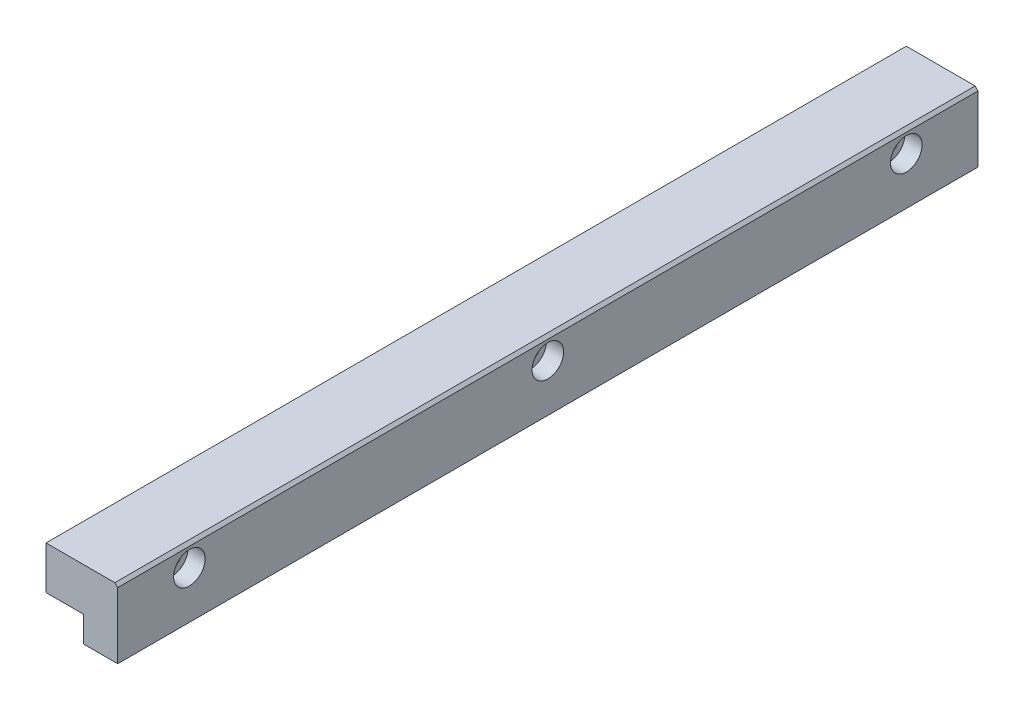
ISO-10303-21;
HEADER;
FILE_DESCRIPTION(('STEP AP214'),'2;1');
FILE_NAME('part.step','',(''),(''),'','','');
FILE_SCHEMA(('AUTOMOTIVE_DESIGN { 1 0 10303 214 1 1 1 1 }'));
ENDSEC;
DATA;
#1=APPLICATION_CONTEXT('core data for automotive mechanical design processes');
#2=APPLICATION_PROTOCOL_DEFINITION('international standard','automotive_design',2000,#1);
#3=PRODUCT_CONTEXT('',#1,'mechanical');
#4=PRODUCT('Part','Part','',(#3));
#5=PRODUCT_RELATED_PRODUCT_CATEGORY('part','',(#4));
#6=PRODUCT_DEFINITION_FORMATION('','',#4);
#7=PRODUCT_DEFINITION_CONTEXT('part definition',#1,'design');
#8=PRODUCT_DEFINITION('design','',#6,#7);
#9=PRODUCT_DEFINITION_SHAPE('','',#8);
#10=(LENGTH_UNIT() NAMED_UNIT(*) SI_UNIT(.MILLI.,.METRE.));
#11=(NAMED_UNIT(*) PLANE_ANGLE_UNIT() SI_UNIT($,.RADIAN.));
#12=(NAMED_UNIT(*) SI_UNIT($,.STERADIAN.) SOLID_ANGLE_UNIT());
#13=UNCERTAINTY_MEASURE_WITH_UNIT(LENGTH_MEASURE(1.E-05),#10,'distance_accuracy_value','');
#14=(GEOMETRIC_REPRESENTATION_CONTEXT(3) GLOBAL_UNCERTAINTY_ASSIGNED_CONTEXT((#13)) GLOBAL_UNIT_ASSIGNED_CONTEXT((#10,
#11,#12)) REPRESENTATION_CONTEXT('',''));
#15=CARTESIAN_POINT('',(0.,0.,0.));
#16=DIRECTION('',(0.,0.,1.));
#17=DIRECTION('',(1.,0.,0.));
#18=AXIS2_PLACEMENT_3D('',#15,#16,#17);
#19=CARTESIAN_POINT('',(25.,440.,-300.));
#20=DIRECTION('',(1.,0.,0.));
#21=DIRECTION('',(0.,1.,0.));
#22=AXIS2_PLACEMENT_3D('',#19,#20,#21);
#23=PLANE('',#22);
#24=CARTESIAN_POINT('',(24.9999999999999,457.5,-25.));
#25=DIRECTION('',(1.,0.,0.));
#26=DIRECTION('',(0.,0.,-1.));
#27=AXIS2_PLACEMENT_3D('',#24,#25,#26);
#28=CIRCLE('',#27,5.50000000000001);
#29=CARTESIAN_POINT('',(24.9999999999999,457.5,-30.5));
#30=VERTEX_POINT('',#29);
#31=EDGE_CURVE('E175',#30,#30,#28,.T.);
#32=ORIENTED_EDGE('',*,*,#31,.F.);
#33=EDGE_LOOP('',(#32));
#34=FACE_BOUND('',#33,.T.);
#35=CARTESIAN_POINT('',(24.9999999999999,457.5,-275.));
#36=DIRECTION('',(1.,0.,0.));
#37=DIRECTION('',(0.,0.,-1.));
#38=AXIS2_PLACEMENT_3D('',#35,#36,#37);
#39=CIRCLE('',#38,5.50000000000001);
#40=CARTESIAN_POINT('',(24.9999999999999,457.5,-280.5));
#41=VERTEX_POINT('',#40);
#42=EDGE_CURVE('E219',#41,#41,#39,.T.);
#43=ORIENTED_EDGE('',*,*,#42,.F.);
#44=EDGE_LOOP('',(#43));
#45=FACE_BOUND('',#44,.T.);
#46=CARTESIAN_POINT('',(24.9999999999999,457.5,-150.));
#47=DIRECTION('',(1.,0.,0.));
#48=DIRECTION('',(0.,0.,-1.));
#49=AXIS2_PLACEMENT_3D('',#46,#47,#48);
#50=CIRCLE('',#49,5.50000000000001);
#51=CARTESIAN_POINT('',(24.9999999999999,457.5,-155.5));
#52=VERTEX_POINT('',#51);
#53=EDGE_CURVE('E207',#52,#52,#50,.T.);
#54=ORIENTED_EDGE('',*,*,#53,.F.);
#55=EDGE_LOOP('',(#54));
#56=FACE_BOUND('',#55,.T.);
#57=DIRECTION('',(0.,1.,0.));
#58=VECTOR('',#57,1.);
#59=CARTESIAN_POINT('',(25.,440.,-300.));
#60=LINE('',#59,#58);
#61=CARTESIAN_POINT('',(25.,441.,-300.));
#62=VERTEX_POINT('',#61);
#63=CARTESIAN_POINT('',(25.,464.,-300.));
#64=VERTEX_POINT('',#63);
#65=EDGE_CURVE('E110',#62,#64,#60,.T.);
#66=ORIENTED_EDGE('',*,*,#65,.T.);
#67=DIRECTION('',(0.,0.,1.));
#68=VECTOR('',#67,1.);
#69=CARTESIAN_POINT('',(25.,464.,-300.));
#70=LINE('',#69,#68);
#71=CARTESIAN_POINT('',(25.,464.,0.));
#72=VERTEX_POINT('',#71);
#73=EDGE_CURVE('E164',#64,#72,#70,.T.);
#74=ORIENTED_EDGE('',*,*,#73,.T.);
#75=DIRECTION('',(0.,1.,0.));
#76=VECTOR('',#75,1.);
#77=CARTESIAN_POINT('',(25.,440.,0.));
#78=LINE('',#77,#76);
#79=CARTESIAN_POINT('',(25.,441.,0.));
#80=VERTEX_POINT('',#79);
#81=EDGE_CURVE('E131',#80,#72,#78,.T.);
#82=ORIENTED_EDGE('',*,*,#81,.F.);
#83=DIRECTION('',(0.,0.,-1.));
#84=VECTOR('',#83,1.);
#85=CARTESIAN_POINT('',(25.,441.,-300.));
#86=LINE('',#85,#84);
#87=EDGE_CURVE('E155',#80,#62,#86,.T.);
#88=ORIENTED_EDGE('',*,*,#87,.T.);
#89=EDGE_LOOP('',(#66,#74,#82,#88));
#90=FACE_BOUND('',#89,.T.);
#91=ADVANCED_FACE('F34',(#34,#45,#56,#90),#23,.T.);
#92=CARTESIAN_POINT('',(25.,440.,-300.));
#93=DIRECTION('',(0.,-1.,0.));
#94=DIRECTION('',(0.,0.,-1.));
#95=AXIS2_PLACEMENT_3D('',#92,#93,#94);
#96=PLANE('',#95);
#97=DIRECTION('',(1.,0.,0.));
#98=VECTOR('',#97,1.);
#99=CARTESIAN_POINT('',(25.,440.,-299.));
#100=LINE('',#99,#98);
#101=CARTESIAN_POINT('',(14.,440.,-299.));
#102=VERTEX_POINT('',#101);
#103=CARTESIAN_POINT('',(24.,440.,-299.));
#104=VERTEX_POINT('',#103);
#105=EDGE_CURVE('E150',#102,#104,#100,.T.);
#106=ORIENTED_EDGE('',*,*,#105,.T.);
#107=DIRECTION('',(0.,0.,1.));
#108=VECTOR('',#107,1.);
#109=CARTESIAN_POINT('',(24.,440.,-300.));
#110=LINE('',#109,#108);
#111=CARTESIAN_POINT('',(24.,440.,-0.999999999999945));
#112=VERTEX_POINT('',#111);
#113=EDGE_CURVE('E152',#104,#112,#110,.T.);
#114=ORIENTED_EDGE('',*,*,#113,.T.);
#115=DIRECTION('',(-1.,0.,0.));
#116=VECTOR('',#115,1.);
#117=CARTESIAN_POINT('',(25.,440.,-0.999999999999945));
#118=LINE('',#117,#116);
#119=CARTESIAN_POINT('',(14.,440.,-0.999999999999945));
#120=VERTEX_POINT('',#119);
#121=EDGE_CURVE('E145',#112,#120,#118,.T.);
#122=ORIENTED_EDGE('',*,*,#121,.T.);
#123=DIRECTION('',(0.,0.,-1.));
#124=VECTOR('',#123,1.);
#125=CARTESIAN_POINT('',(14.,440.,-300.));
#126=LINE('',#125,#124);
#127=EDGE_CURVE('E148',#120,#102,#126,.T.);
#128=ORIENTED_EDGE('',*,*,#127,.T.);
#129=EDGE_LOOP('',(#106,#114,#122,#128));
#130=FACE_BOUND('',#129,.T.);
#131=ADVANCED_FACE('F238',(#130),#96,.T.);
#132=CARTESIAN_POINT('',(13.,440.,-300.));
#133=DIRECTION('',(-1.,0.,0.));
#134=DIRECTION('',(0.,0.,1.));
#135=AXIS2_PLACEMENT_3D('',#132,#133,#134);
#136=PLANE('',#135);
#137=DIRECTION('',(0.,-1.,0.));
#138=VECTOR('',#137,1.);
#139=CARTESIAN_POINT('',(13.,440.,-300.));
#140=LINE('',#139,#138);
#141=CARTESIAN_POINT('',(13.,450.,-300.));
#142=VERTEX_POINT('',#141);
#143=CARTESIAN_POINT('',(13.,441.,-300.));
#144=VERTEX_POINT('',#143);
#145=EDGE_CURVE('E118',#142,#144,#140,.T.);
#146=ORIENTED_EDGE('',*,*,#145,.T.);
#147=DIRECTION('',(0.,0.,1.));
#148=VECTOR('',#147,1.);
#149=CARTESIAN_POINT('',(13.,441.,-300.));
#150=LINE('',#149,#148);
#151=CARTESIAN_POINT('',(13.,441.,0.));
#152=VERTEX_POINT('',#151);
#153=EDGE_CURVE('E160',#144,#152,#150,.T.);
#154=ORIENTED_EDGE('',*,*,#153,.T.);
#155=DIRECTION('',(0.,-1.,0.));
#156=VECTOR('',#155,1.);
#157=CARTESIAN_POINT('',(13.,440.,0.));
#158=LINE('',#157,#156);
#159=CARTESIAN_POINT('',(13.,450.,0.));
#160=VERTEX_POINT('',#159);
#161=EDGE_CURVE('E140',#160,#152,#158,.T.);
#162=ORIENTED_EDGE('',*,*,#161,.F.);
#163=DIRECTION('',(0.,0.,1.));
#164=VECTOR('',#163,1.);
#165=CARTESIAN_POINT('',(13.,450.,-300.));
#166=LINE('',#165,#164);
#167=EDGE_CURVE('E143',#142,#160,#166,.T.);
#168=ORIENTED_EDGE('',*,*,#167,.F.);
#169=EDGE_LOOP('',(#146,#154,#162,#168));
#170=FACE_BOUND('',#169,.T.);
#171=ADVANCED_FACE('F272',(#170),#136,.T.);
#172=CARTESIAN_POINT('',(0.,450.,-300.));
#173=DIRECTION('',(0.,-1.,0.));
#174=DIRECTION('',(0.,0.,-1.));
#175=AXIS2_PLACEMENT_3D('',#172,#173,#174);
#176=PLANE('',#175);
#177=DIRECTION('',(1.,0.,0.));
#178=VECTOR('',#177,1.);
#179=CARTESIAN_POINT('',(0.,450.,0.));
#180=LINE('',#179,#178);
#181=CARTESIAN_POINT('',(0.,450.,0.));
#182=VERTEX_POINT('',#181);
#183=EDGE_CURVE('E137',#182,#160,#180,.T.);
#184=ORIENTED_EDGE('',*,*,#183,.F.);
#185=DIRECTION('',(0.,0.,1.));
#186=VECTOR('',#185,1.);
#187=CARTESIAN_POINT('',(0.,450.,-300.));
#188=LINE('',#187,#186);
#189=CARTESIAN_POINT('',(0.,450.,-300.));
#190=VERTEX_POINT('',#189);
#191=EDGE_CURVE('E117',#190,#182,#188,.T.);
#192=ORIENTED_EDGE('',*,*,#191,.F.);
#193=DIRECTION('',(1.,0.,0.));
#194=VECTOR('',#193,1.);
#195=CARTESIAN_POINT('',(0.,450.,-300.));
#196=LINE('',#195,#194);
#197=EDGE_CURVE('E124',#190,#142,#196,.T.);
#198=ORIENTED_EDGE('',*,*,#197,.T.);
#199=ORIENTED_EDGE('',*,*,#167,.T.);
#200=EDGE_LOOP('',(#184,#192,#198,#199));
#201=FACE_BOUND('',#200,.T.);
#202=ADVANCED_FACE('F276',(#201),#176,.T.);
#203=CARTESIAN_POINT('',(0.,450.,-300.));
#204=DIRECTION('',(-1.,0.,0.));
#205=DIRECTION('',(0.,0.,1.));
#206=AXIS2_PLACEMENT_3D('',#203,#204,#205);
#207=PLANE('',#206);
#208=CARTESIAN_POINT('',(0.,457.5,-25.));
#209=DIRECTION('',(1.,0.,0.));
#210=DIRECTION('',(0.,0.,-1.));
#211=AXIS2_PLACEMENT_3D('',#208,#209,#210);
#212=CIRCLE('',#211,3.19999999999998);
#213=CARTESIAN_POINT('',(0.,457.5,-28.2));
#214=VERTEX_POINT('',#213);
#215=EDGE_CURVE('E222',#214,#214,#212,.T.);
#216=ORIENTED_EDGE('',*,*,#215,.T.);
#217=EDGE_LOOP('',(#216));
#218=FACE_BOUND('',#217,.T.);
#219=CARTESIAN_POINT('',(0.,457.5,-275.));
#220=DIRECTION('',(1.,0.,0.));
#221=DIRECTION('',(0.,0.,-1.));
#222=AXIS2_PLACEMENT_3D('',#219,#220,#221);
#223=CIRCLE('',#222,3.19999999999998);
#224=CARTESIAN_POINT('',(0.,457.5,-278.2));
#225=VERTEX_POINT('',#224);
#226=EDGE_CURVE('E210',#225,#225,#223,.T.);
#227=ORIENTED_EDGE('',*,*,#226,.T.);
#228=EDGE_LOOP('',(#227));
#229=FACE_BOUND('',#228,.T.);
#230=CARTESIAN_POINT('',(0.,457.5,-150.));
#231=DIRECTION('',(1.,0.,0.));
#232=DIRECTION('',(0.,0.,-1.));
#233=AXIS2_PLACEMENT_3D('',#230,#231,#232);
#234=CIRCLE('',#233,3.19999999999998);
#235=CARTESIAN_POINT('',(0.,457.5,-153.2));
#236=VERTEX_POINT('',#235);
#237=EDGE_CURVE('E134',#236,#236,#234,.T.);
#238=ORIENTED_EDGE('',*,*,#237,.T.);
#239=EDGE_LOOP('',(#238));
#240=FACE_BOUND('',#239,.T.);
#241=DIRECTION('',(0.,-1.,0.));
#242=VECTOR('',#241,1.);
#243=CARTESIAN_POINT('',(0.,450.,0.));
#244=LINE('',#243,#242);
#245=CARTESIAN_POINT('',(0.,465.,0.));
#246=VERTEX_POINT('',#245);
#247=EDGE_CURVE('E116',#246,#182,#244,.T.);
#248=ORIENTED_EDGE('',*,*,#247,.F.);
#249=DIRECTION('',(0.,0.,1.));
#250=VECTOR('',#249,1.);
#251=CARTESIAN_POINT('',(0.,465.,-300.));
#252=LINE('',#251,#250);
#253=CARTESIAN_POINT('',(0.,465.,-300.));
#254=VERTEX_POINT('',#253);
#255=EDGE_CURVE('E104',#254,#246,#252,.T.);
#256=ORIENTED_EDGE('',*,*,#255,.F.);
#257=DIRECTION('',(0.,-1.,0.));
#258=VECTOR('',#257,1.);
#259=CARTESIAN_POINT('',(0.,450.,-300.));
#260=LINE('',#259,#258);
#261=EDGE_CURVE('E109',#254,#190,#260,.T.);
#262=ORIENTED_EDGE('',*,*,#261,.T.);
#263=ORIENTED_EDGE('',*,*,#191,.T.);
#264=EDGE_LOOP('',(#248,#256,#262,#263));
#265=FACE_BOUND('',#264,.T.);
#266=ADVANCED_FACE('F114',(#218,#229,#240,#265),#207,.T.);
#267=CARTESIAN_POINT('',(25.,465.,-300.));
#268=DIRECTION('',(0.,1.,0.));
#269=DIRECTION('',(0.,0.,1.));
#270=AXIS2_PLACEMENT_3D('',#267,#268,#269);
#271=PLANE('',#270);
#272=DIRECTION('',(-1.,0.,0.));
#273=VECTOR('',#272,1.);
#274=CARTESIAN_POINT('',(25.,465.,0.));
#275=LINE('',#274,#273);
#276=CARTESIAN_POINT('',(24.,465.,0.));
#277=VERTEX_POINT('',#276);
#278=EDGE_CURVE('E133',#277,#246,#275,.T.);
#279=ORIENTED_EDGE('',*,*,#278,.F.);
#280=DIRECTION('',(0.,0.,-1.));
#281=VECTOR('',#280,1.);
#282=CARTESIAN_POINT('',(24.,465.,-300.));
#283=LINE('',#282,#281);
#284=CARTESIAN_POINT('',(24.,465.,-300.));
#285=VERTEX_POINT('',#284);
#286=EDGE_CURVE('E42',#277,#285,#283,.T.);
#287=ORIENTED_EDGE('',*,*,#286,.T.);
#288=DIRECTION('',(-1.,0.,0.));
#289=VECTOR('',#288,1.);
#290=CARTESIAN_POINT('',(25.,465.,-300.));
#291=LINE('',#290,#289);
#292=EDGE_CURVE('E101',#285,#254,#291,.T.);
#293=ORIENTED_EDGE('',*,*,#292,.T.);
#294=ORIENTED_EDGE('',*,*,#255,.T.);
#295=EDGE_LOOP('',(#279,#287,#293,#294));
#296=FACE_BOUND('',#295,.T.);
#297=ADVANCED_FACE('F103',(#296),#271,.T.);
#298=CARTESIAN_POINT('',(0.,0.,-300.));
#299=DIRECTION('',(0.,0.,1.));
#300=DIRECTION('',(1.,0.,0.));
#301=AXIS2_PLACEMENT_3D('',#298,#299,#300);
#302=PLANE('',#301);
#303=ORIENTED_EDGE('',*,*,#292,.F.);
#304=DIRECTION('',(-0.707106781186538,0.707106781186557,0.));
#305=VECTOR('',#304,1.);
#306=CARTESIAN_POINT('',(25.,464.,-300.));
#307=LINE('',#306,#305);
#308=EDGE_CURVE('E11',#285,#64,#307,.F.);
#309=ORIENTED_EDGE('',*,*,#308,.T.);
#310=ORIENTED_EDGE('',*,*,#65,.F.);
#311=DIRECTION('',(-1.,0.,0.));
#312=VECTOR('',#311,1.);
#313=CARTESIAN_POINT('',(13.,441.,-300.));
#314=LINE('',#313,#312);
#315=EDGE_CURVE('E158',#62,#144,#314,.T.);
#316=ORIENTED_EDGE('',*,*,#315,.T.);
#317=ORIENTED_EDGE('',*,*,#145,.F.);
#318=ORIENTED_EDGE('',*,*,#197,.F.);
#319=ORIENTED_EDGE('',*,*,#261,.F.);
#320=EDGE_LOOP('',(#303,#309,#310,#316,#317,#318,#319));
#321=FACE_BOUND('',#320,.T.);
#322=ADVANCED_FACE('F121',(#321),#302,.F.);
#323=CARTESIAN_POINT('',(0.,0.,0.));
#324=DIRECTION('',(0.,0.,1.));
#325=DIRECTION('',(1.,0.,0.));
#326=AXIS2_PLACEMENT_3D('',#323,#324,#325);
#327=PLANE('',#326);
#328=ORIENTED_EDGE('',*,*,#81,.T.);
#329=DIRECTION('',(0.707106781186538,-0.707106781186557,0.));
#330=VECTOR('',#329,1.);
#331=CARTESIAN_POINT('',(244.5,244.499999999994,0.));
#332=LINE('',#331,#330);
#333=EDGE_CURVE('E56',#72,#277,#332,.F.);
#334=ORIENTED_EDGE('',*,*,#333,.T.);
#335=ORIENTED_EDGE('',*,*,#278,.T.);
#336=ORIENTED_EDGE('',*,*,#247,.T.);
#337=ORIENTED_EDGE('',*,*,#183,.T.);
#338=ORIENTED_EDGE('',*,*,#161,.T.);
#339=DIRECTION('',(1.,0.,0.));
#340=VECTOR('',#339,1.);
#341=CARTESIAN_POINT('',(0.,441.,0.));
#342=LINE('',#341,#340);
#343=EDGE_CURVE('E162',#152,#80,#342,.T.);
#344=ORIENTED_EDGE('',*,*,#343,.T.);
#345=EDGE_LOOP('',(#328,#334,#335,#336,#337,#338,#344));
#346=FACE_BOUND('',#345,.T.);
#347=ADVANCED_FACE('F185',(#346),#327,.T.);
#348=CARTESIAN_POINT('',(24.9999999999999,457.5,-150.));
#349=DIRECTION('',(1.,0.,0.));
#350=DIRECTION('',(0.,0.,-1.));
#351=AXIS2_PLACEMENT_3D('',#348,#349,#350);
#352=CYLINDRICAL_SURFACE('',#351,3.19999999999998);
#353=ORIENTED_EDGE('',*,*,#237,.F.);
#354=EDGE_LOOP('',(#353));
#355=FACE_BOUND('',#354,.T.);
#356=CARTESIAN_POINT('',(18.9999999999999,457.5,-150.));
#357=DIRECTION('',(1.,0.,0.));
#358=DIRECTION('',(0.,0.,-1.));
#359=AXIS2_PLACEMENT_3D('',#356,#357,#358);
#360=CIRCLE('',#359,3.19999999999998);
#361=CARTESIAN_POINT('',(18.9999999999999,457.5,-153.2));
#362=VERTEX_POINT('',#361);
#363=EDGE_CURVE('E201',#362,#362,#360,.T.);
#364=ORIENTED_EDGE('',*,*,#363,.T.);
#365=EDGE_LOOP('',(#364));
#366=FACE_BOUND('',#365,.T.);
#367=ADVANCED_FACE('F257',(#355,#366),#352,.F.);
#368=CARTESIAN_POINT('',(18.9999999999999,460.7,-150.));
#369=DIRECTION('',(-1.,0.,0.));
#370=DIRECTION('',(0.,0.,1.));
#371=AXIS2_PLACEMENT_3D('',#368,#369,#370);
#372=PLANE('',#371);
#373=ORIENTED_EDGE('',*,*,#363,.F.);
#374=EDGE_LOOP('',(#373));
#375=FACE_BOUND('',#374,.T.);
#376=CARTESIAN_POINT('',(18.9999999999999,457.5,-150.));
#377=DIRECTION('',(1.,0.,0.));
#378=DIRECTION('',(0.,0.,-1.));
#379=AXIS2_PLACEMENT_3D('',#376,#377,#378);
#380=CIRCLE('',#379,5.50000000000001);
#381=CARTESIAN_POINT('',(18.9999999999999,457.5,-155.5));
#382=VERTEX_POINT('',#381);
#383=EDGE_CURVE('E204',#382,#382,#380,.T.);
#384=ORIENTED_EDGE('',*,*,#383,.T.);
#385=EDGE_LOOP('',(#384));
#386=FACE_BOUND('',#385,.T.);
#387=ADVANCED_FACE('F247',(#375,#386),#372,.F.);
#388=CARTESIAN_POINT('',(24.9999999999999,457.5,-150.));
#389=DIRECTION('',(1.,0.,0.));
#390=DIRECTION('',(0.,0.,-1.));
#391=AXIS2_PLACEMENT_3D('',#388,#389,#390);
#392=CYLINDRICAL_SURFACE('',#391,5.50000000000001);
#393=ORIENTED_EDGE('',*,*,#383,.F.);
#394=EDGE_LOOP('',(#393));
#395=FACE_BOUND('',#394,.T.);
#396=ORIENTED_EDGE('',*,*,#53,.T.);
#397=EDGE_LOOP('',(#396));
#398=FACE_BOUND('',#397,.T.);
#399=ADVANCED_FACE('F244',(#395,#398),#392,.F.);
#400=CARTESIAN_POINT('',(24.9999999999999,457.5,-275.));
#401=DIRECTION('',(1.,0.,0.));
#402=DIRECTION('',(0.,0.,-1.));
#403=AXIS2_PLACEMENT_3D('',#400,#401,#402);
#404=CYLINDRICAL_SURFACE('',#403,3.19999999999998);
#405=ORIENTED_EDGE('',*,*,#226,.F.);
#406=EDGE_LOOP('',(#405));
#407=FACE_BOUND('',#406,.T.);
#408=CARTESIAN_POINT('',(18.9999999999999,457.5,-275.));
#409=DIRECTION('',(1.,0.,0.));
#410=DIRECTION('',(0.,0.,-1.));
#411=AXIS2_PLACEMENT_3D('',#408,#409,#410);
#412=CIRCLE('',#411,3.19999999999998);
#413=CARTESIAN_POINT('',(18.9999999999999,457.5,-278.2));
#414=VERTEX_POINT('',#413);
#415=EDGE_CURVE('E213',#414,#414,#412,.T.);
#416=ORIENTED_EDGE('',*,*,#415,.T.);
#417=EDGE_LOOP('',(#416));
#418=FACE_BOUND('',#417,.T.);
#419=ADVANCED_FACE('F246',(#407,#418),#404,.F.);
#420=CARTESIAN_POINT('',(18.9999999999999,460.7,-275.));
#421=DIRECTION('',(-1.,0.,0.));
#422=DIRECTION('',(0.,0.,1.));
#423=AXIS2_PLACEMENT_3D('',#420,#421,#422);
#424=PLANE('',#423);
#425=ORIENTED_EDGE('',*,*,#415,.F.);
#426=EDGE_LOOP('',(#425));
#427=FACE_BOUND('',#426,.T.);
#428=CARTESIAN_POINT('',(18.9999999999999,457.5,-275.));
#429=DIRECTION('',(1.,0.,0.));
#430=DIRECTION('',(0.,0.,-1.));
#431=AXIS2_PLACEMENT_3D('',#428,#429,#430);
#432=CIRCLE('',#431,5.50000000000001);
#433=CARTESIAN_POINT('',(18.9999999999999,457.5,-280.5));
#434=VERTEX_POINT('',#433);
#435=EDGE_CURVE('E216',#434,#434,#432,.T.);
#436=ORIENTED_EDGE('',*,*,#435,.T.);
#437=EDGE_LOOP('',(#436));
#438=FACE_BOUND('',#437,.T.);
#439=ADVANCED_FACE('F254',(#427,#438),#424,.F.);
#440=CARTESIAN_POINT('',(24.9999999999999,457.5,-275.));
#441=DIRECTION('',(1.,0.,0.));
#442=DIRECTION('',(0.,0.,-1.));
#443=AXIS2_PLACEMENT_3D('',#440,#441,#442);
#444=CYLINDRICAL_SURFACE('',#443,5.50000000000001);
#445=ORIENTED_EDGE('',*,*,#435,.F.);
#446=EDGE_LOOP('',(#445));
#447=FACE_BOUND('',#446,.T.);
#448=ORIENTED_EDGE('',*,*,#42,.T.);
#449=EDGE_LOOP('',(#448));
#450=FACE_BOUND('',#449,.T.);
#451=ADVANCED_FACE('F353',(#447,#450),#444,.F.);
#452=CARTESIAN_POINT('',(24.9999999999999,457.5,-25.));
#453=DIRECTION('',(1.,0.,0.));
#454=DIRECTION('',(0.,0.,-1.));
#455=AXIS2_PLACEMENT_3D('',#452,#453,#454);
#456=CYLINDRICAL_SURFACE('',#455,3.19999999999998);
#457=ORIENTED_EDGE('',*,*,#215,.F.);
#458=EDGE_LOOP('',(#457));
#459=FACE_BOUND('',#458,.T.);
#460=CARTESIAN_POINT('',(18.9999999999999,457.5,-25.));
#461=DIRECTION('',(1.,0.,0.));
#462=DIRECTION('',(0.,0.,-1.));
#463=AXIS2_PLACEMENT_3D('',#460,#461,#462);
#464=CIRCLE('',#463,3.19999999999998);
#465=CARTESIAN_POINT('',(18.9999999999999,457.5,-28.2));
#466=VERTEX_POINT('',#465);
#467=EDGE_CURVE('E225',#466,#466,#464,.T.);
#468=ORIENTED_EDGE('',*,*,#467,.T.);
#469=EDGE_LOOP('',(#468));
#470=FACE_BOUND('',#469,.T.);
#471=ADVANCED_FACE('F343',(#459,#470),#456,.F.);
#472=CARTESIAN_POINT('',(18.9999999999999,460.7,-25.));
#473=DIRECTION('',(-1.,0.,0.));
#474=DIRECTION('',(0.,0.,1.));
#475=AXIS2_PLACEMENT_3D('',#472,#473,#474);
#476=PLANE('',#475);
#477=ORIENTED_EDGE('',*,*,#467,.F.);
#478=EDGE_LOOP('',(#477));
#479=FACE_BOUND('',#478,.T.);
#480=CARTESIAN_POINT('',(18.9999999999999,457.5,-25.));
#481=DIRECTION('',(1.,0.,0.));
#482=DIRECTION('',(0.,0.,-1.));
#483=AXIS2_PLACEMENT_3D('',#480,#481,#482);
#484=CIRCLE('',#483,5.50000000000001);
#485=CARTESIAN_POINT('',(18.9999999999999,457.5,-30.5));
#486=VERTEX_POINT('',#485);
#487=EDGE_CURVE('E228',#486,#486,#484,.T.);
#488=ORIENTED_EDGE('',*,*,#487,.T.);
#489=EDGE_LOOP('',(#488));
#490=FACE_BOUND('',#489,.T.);
#491=ADVANCED_FACE('F299',(#479,#490),#476,.F.);
#492=CARTESIAN_POINT('',(24.9999999999999,457.5,-25.));
#493=DIRECTION('',(1.,0.,0.));
#494=DIRECTION('',(0.,0.,-1.));
#495=AXIS2_PLACEMENT_3D('',#492,#493,#494);
#496=CYLINDRICAL_SURFACE('',#495,5.50000000000001);
#497=ORIENTED_EDGE('',*,*,#487,.F.);
#498=EDGE_LOOP('',(#497));
#499=FACE_BOUND('',#498,.T.);
#500=ORIENTED_EDGE('',*,*,#31,.T.);
#501=EDGE_LOOP('',(#500));
#502=FACE_BOUND('',#501,.T.);
#503=ADVANCED_FACE('F234',(#499,#502),#496,.F.);
#504=CARTESIAN_POINT('',(13.,441.,-300.));
#505=DIRECTION('',(0.707106781186557,0.707106781186538,0.));
#506=DIRECTION('',(0.,0.,1.));
#507=AXIS2_PLACEMENT_3D('',#504,#505,#506);
#508=PLANE('',#507);
#509=DIRECTION('',(0.577350269189626,-0.577350269189642,-0.57735026918961));
#510=VECTOR('',#509,1.);
#511=CARTESIAN_POINT('',(8.66666666666666,445.333333333333,4.33333333333321));
#512=LINE('',#511,#510);
#513=EDGE_CURVE('E169',#152,#120,#512,.T.);
#514=ORIENTED_EDGE('',*,*,#513,.F.);
#515=ORIENTED_EDGE('',*,*,#153,.F.);
#516=DIRECTION('',(-0.577350269189626,0.577350269189642,-0.57735026918961));
#517=VECTOR('',#516,1.);
#518=CARTESIAN_POINT('',(13.,441.,-300.));
#519=LINE('',#518,#517);
#520=EDGE_CURVE('E172',#102,#144,#519,.T.);
#521=ORIENTED_EDGE('',*,*,#520,.F.);
#522=ORIENTED_EDGE('',*,*,#127,.F.);
#523=EDGE_LOOP('',(#514,#515,#521,#522));
#524=FACE_BOUND('',#523,.T.);
#525=ADVANCED_FACE('F292',(#524),#508,.F.);
#526=CARTESIAN_POINT('',(25.,440.,-299.));
#527=DIRECTION('',(0.,-0.707106781186528,-0.707106781186567));
#528=DIRECTION('',(-1.,0.,0.));
#529=AXIS2_PLACEMENT_3D('',#526,#527,#528);
#530=PLANE('',#529);
#531=ORIENTED_EDGE('',*,*,#520,.T.);
#532=ORIENTED_EDGE('',*,*,#315,.F.);
#533=DIRECTION('',(0.577350269189626,0.577350269189642,-0.57735026918961));
#534=VECTOR('',#533,1.);
#535=CARTESIAN_POINT('',(24.3333333333333,440.333333333333,-299.333333333333));
#536=LINE('',#535,#534);
#537=EDGE_CURVE('E167',#104,#62,#536,.T.);
#538=ORIENTED_EDGE('',*,*,#537,.F.);
#539=ORIENTED_EDGE('',*,*,#105,.F.);
#540=EDGE_LOOP('',(#531,#532,#538,#539));
#541=FACE_BOUND('',#540,.T.);
#542=ADVANCED_FACE('F290',(#541),#530,.T.);
#543=CARTESIAN_POINT('',(0.,441.,0.));
#544=DIRECTION('',(0.,0.707106781186528,-0.707106781186567));
#545=DIRECTION('',(1.,0.,0.));
#546=AXIS2_PLACEMENT_3D('',#543,#544,#545);
#547=PLANE('',#546);
#548=ORIENTED_EDGE('',*,*,#513,.T.);
#549=ORIENTED_EDGE('',*,*,#121,.F.);
#550=DIRECTION('',(0.577350269189626,0.577350269189642,0.57735026918961));
#551=VECTOR('',#550,1.);
#552=CARTESIAN_POINT('',(16.6666666666667,432.666666666666,-8.3333333333331));
#553=LINE('',#552,#551);
#554=EDGE_CURVE('E165',#80,#112,#553,.F.);
#555=ORIENTED_EDGE('',*,*,#554,.F.);
#556=ORIENTED_EDGE('',*,*,#343,.F.);
#557=EDGE_LOOP('',(#548,#549,#555,#556));
#558=FACE_BOUND('',#557,.T.);
#559=ADVANCED_FACE('F191',(#558),#547,.F.);
#560=CARTESIAN_POINT('',(24.,440.,-300.));
#561=DIRECTION('',(-0.707106781186557,0.707106781186538,0.));
#562=DIRECTION('',(0.,0.,1.));
#563=AXIS2_PLACEMENT_3D('',#560,#561,#562);
#564=PLANE('',#563);
#565=ORIENTED_EDGE('',*,*,#537,.T.);
#566=ORIENTED_EDGE('',*,*,#87,.F.);
#567=ORIENTED_EDGE('',*,*,#554,.T.);
#568=ORIENTED_EDGE('',*,*,#113,.F.);
#569=EDGE_LOOP('',(#565,#566,#567,#568));
#570=FACE_BOUND('',#569,.T.);
#571=ADVANCED_FACE('F195',(#570),#564,.F.);
#572=CARTESIAN_POINT('',(25.,464.,-300.));
#573=DIRECTION('',(-0.707106781186557,-0.707106781186538,0.));
#574=DIRECTION('',(0.,0.,1.));
#575=AXIS2_PLACEMENT_3D('',#572,#573,#574);
#576=PLANE('',#575);
#577=ORIENTED_EDGE('',*,*,#308,.F.);
#578=ORIENTED_EDGE('',*,*,#286,.F.);
#579=ORIENTED_EDGE('',*,*,#333,.F.);
#580=ORIENTED_EDGE('',*,*,#73,.F.);
#581=EDGE_LOOP('',(#577,#578,#579,#580));
#582=FACE_BOUND('',#581,.T.);
#583=ADVANCED_FACE('F36',(#582),#576,.F.);
#584=CLOSED_SHELL('',(#91,#131,#171,#202,#266,#297,#322,#347,#367,#387,#399,#419,#439,#451,#471,
#491,#503,#525,#542,#559,#571,#583));
#585=MANIFOLD_SOLID_BREP('B2',#584);
#586=ADVANCED_BREP_SHAPE_REPRESENTATION('',(#18,#585),#14);
#587=SHAPE_DEFINITION_REPRESENTATION(#9,#586);
ENDSEC;
END-ISO-10303-21;
